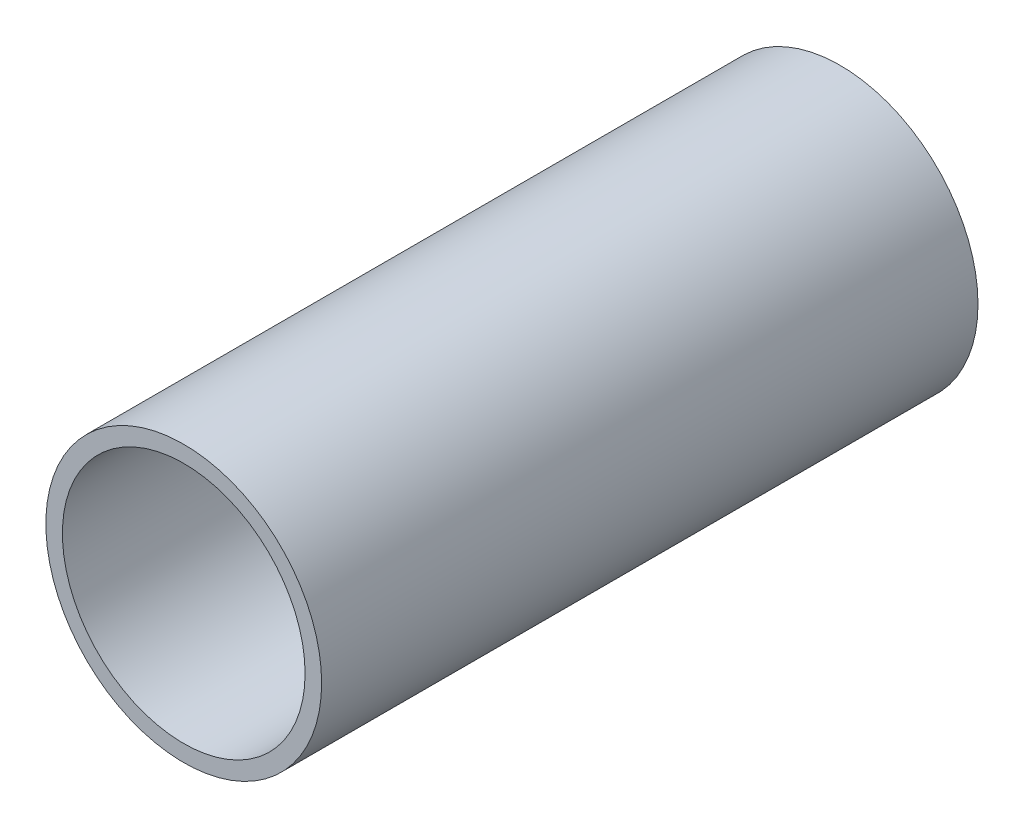
ISO-10303-21;
HEADER;
FILE_DESCRIPTION(('STEP AP214'),'2;1');
FILE_NAME('part.step','',(''),(''),'','','');
FILE_SCHEMA(('AUTOMOTIVE_DESIGN { 1 0 10303 214 1 1 1 1 }'));
ENDSEC;
DATA;
#1=APPLICATION_CONTEXT('core data for automotive mechanical design processes');
#2=APPLICATION_PROTOCOL_DEFINITION('international standard','automotive_design',2000,#1);
#3=PRODUCT_CONTEXT('',#1,'mechanical');
#4=PRODUCT('Part','Part','',(#3));
#5=PRODUCT_RELATED_PRODUCT_CATEGORY('part','',(#4));
#6=PRODUCT_DEFINITION_FORMATION('','',#4);
#7=PRODUCT_DEFINITION_CONTEXT('part definition',#1,'design');
#8=PRODUCT_DEFINITION('design','',#6,#7);
#9=PRODUCT_DEFINITION_SHAPE('','',#8);
#10=(LENGTH_UNIT() NAMED_UNIT(*) SI_UNIT(.MILLI.,.METRE.));
#11=(NAMED_UNIT(*) PLANE_ANGLE_UNIT() SI_UNIT($,.RADIAN.));
#12=(NAMED_UNIT(*) SI_UNIT($,.STERADIAN.) SOLID_ANGLE_UNIT());
#13=UNCERTAINTY_MEASURE_WITH_UNIT(LENGTH_MEASURE(1.E-05),#10,'distance_accuracy_value','');
#14=(GEOMETRIC_REPRESENTATION_CONTEXT(3) GLOBAL_UNCERTAINTY_ASSIGNED_CONTEXT((#13)) GLOBAL_UNIT_ASSIGNED_CONTEXT((#10,
#11,#12)) REPRESENTATION_CONTEXT('',''));
#15=CARTESIAN_POINT('',(0.,0.,0.));
#16=DIRECTION('',(0.,0.,1.));
#17=DIRECTION('',(1.,0.,0.));
#18=AXIS2_PLACEMENT_3D('',#15,#16,#17);
#19=CARTESIAN_POINT('',(0.,0.,30.226));
#20=DIRECTION('',(0.,0.,1.));
#21=DIRECTION('',(1.,0.,0.));
#22=AXIS2_PLACEMENT_3D('',#19,#20,#21);
#23=PLANE('',#22);
#24=CARTESIAN_POINT('',(0.,0.,30.226));
#25=DIRECTION('',(0.,0.,1.));
#26=DIRECTION('',(1.,0.,0.));
#27=AXIS2_PLACEMENT_3D('',#24,#25,#26);
#28=CIRCLE('',#27,6.35);
#29=CARTESIAN_POINT('',(6.35,0.,30.226));
#30=VERTEX_POINT('',#29);
#31=EDGE_CURVE('E10',#30,#30,#28,.T.);
#32=ORIENTED_EDGE('',*,*,#31,.T.);
#33=EDGE_LOOP('',(#32));
#34=FACE_BOUND('',#33,.T.);
#35=CARTESIAN_POINT('',(0.,0.,30.226));
#36=DIRECTION('',(0.,0.,1.));
#37=DIRECTION('',(1.,0.,0.));
#38=AXIS2_PLACEMENT_3D('',#35,#36,#37);
#39=CIRCLE('',#38,5.588);
#40=CARTESIAN_POINT('',(5.588,0.,30.226));
#41=VERTEX_POINT('',#40);
#42=EDGE_CURVE('E46',#41,#41,#39,.T.);
#43=ORIENTED_EDGE('',*,*,#42,.F.);
#44=EDGE_LOOP('',(#43));
#45=FACE_BOUND('',#44,.T.);
#46=ADVANCED_FACE('F35',(#34,#45),#23,.T.);
#47=CARTESIAN_POINT('',(0.,0.,0.));
#48=DIRECTION('',(0.,0.,1.));
#49=DIRECTION('',(1.,0.,0.));
#50=AXIS2_PLACEMENT_3D('',#47,#48,#49);
#51=PLANE('',#50);
#52=CARTESIAN_POINT('',(0.,0.,0.));
#53=DIRECTION('',(0.,0.,1.));
#54=DIRECTION('',(1.,0.,0.));
#55=AXIS2_PLACEMENT_3D('',#52,#53,#54);
#56=CIRCLE('',#55,6.35);
#57=CARTESIAN_POINT('',(6.35,0.,0.));
#58=VERTEX_POINT('',#57);
#59=EDGE_CURVE('E39',#58,#58,#56,.T.);
#60=ORIENTED_EDGE('',*,*,#59,.F.);
#61=EDGE_LOOP('',(#60));
#62=FACE_BOUND('',#61,.T.);
#63=CARTESIAN_POINT('',(0.,0.,0.));
#64=DIRECTION('',(0.,0.,1.));
#65=DIRECTION('',(1.,0.,0.));
#66=AXIS2_PLACEMENT_3D('',#63,#64,#65);
#67=CIRCLE('',#66,5.588);
#68=CARTESIAN_POINT('',(5.588,0.,0.));
#69=VERTEX_POINT('',#68);
#70=EDGE_CURVE('E48',#69,#69,#67,.T.);
#71=ORIENTED_EDGE('',*,*,#70,.T.);
#72=EDGE_LOOP('',(#71));
#73=FACE_BOUND('',#72,.T.);
#74=ADVANCED_FACE('F58',(#62,#73),#51,.F.);
#75=CARTESIAN_POINT('',(0.,0.,30.226));
#76=DIRECTION('',(0.,0.,-1.));
#77=DIRECTION('',(-1.,0.,0.));
#78=AXIS2_PLACEMENT_3D('',#75,#76,#77);
#79=CYLINDRICAL_SURFACE('',#78,6.35);
#80=ORIENTED_EDGE('',*,*,#31,.F.);
#81=EDGE_LOOP('',(#80));
#82=FACE_BOUND('',#81,.T.);
#83=ORIENTED_EDGE('',*,*,#59,.T.);
#84=EDGE_LOOP('',(#83));
#85=FACE_BOUND('',#84,.T.);
#86=ADVANCED_FACE('F37',(#82,#85),#79,.T.);
#87=CARTESIAN_POINT('',(0.,0.,30.226));
#88=DIRECTION('',(0.,0.,-1.));
#89=DIRECTION('',(-1.,0.,0.));
#90=AXIS2_PLACEMENT_3D('',#87,#88,#89);
#91=CYLINDRICAL_SURFACE('',#90,5.588);
#92=ORIENTED_EDGE('',*,*,#42,.T.);
#93=EDGE_LOOP('',(#92));
#94=FACE_BOUND('',#93,.T.);
#95=ORIENTED_EDGE('',*,*,#70,.F.);
#96=EDGE_LOOP('',(#95));
#97=FACE_BOUND('',#96,.T.);
#98=ADVANCED_FACE('F54',(#94,#97),#91,.F.);
#99=CLOSED_SHELL('',(#46,#74,#86,#98));
#100=MANIFOLD_SOLID_BREP('B2',#99);
#101=ADVANCED_BREP_SHAPE_REPRESENTATION('',(#18,#100),#14);
#102=SHAPE_DEFINITION_REPRESENTATION(#9,#101);
ENDSEC;
END-ISO-10303-21;
